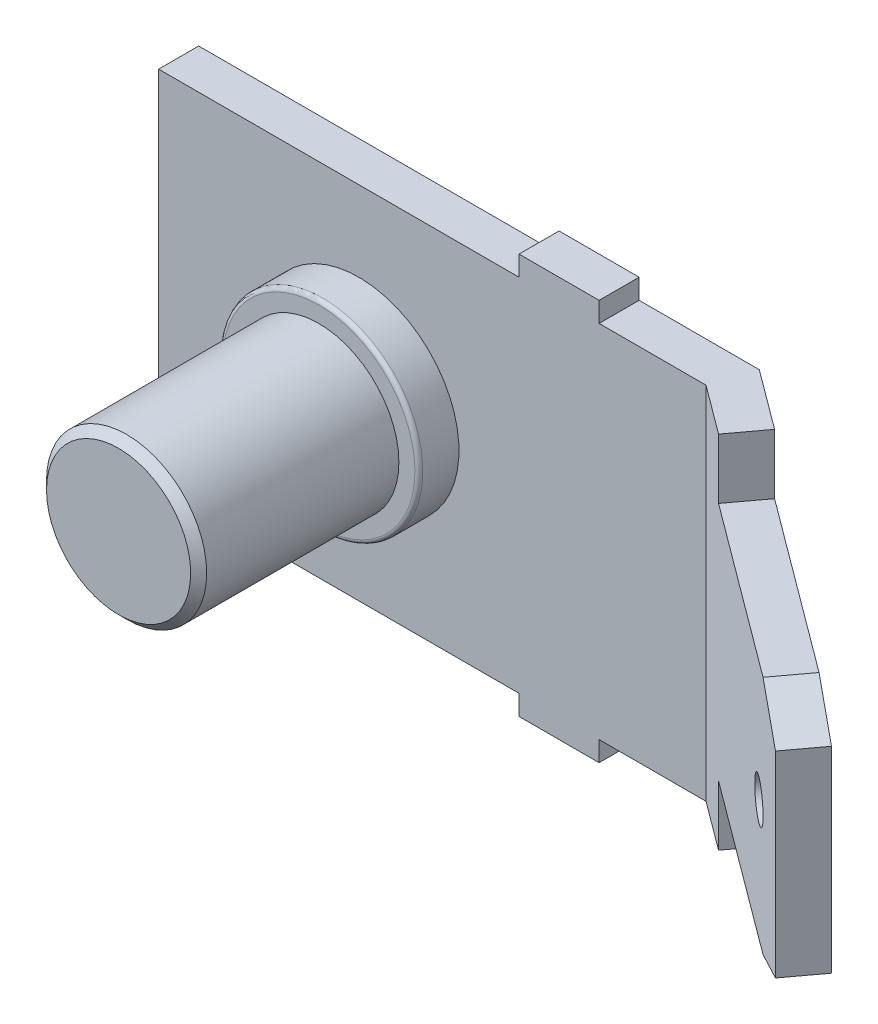
ISO-10303-21;
HEADER;
FILE_DESCRIPTION(('STEP AP214'),'2;1');
FILE_NAME('part.step','',(''),(''),'','','');
FILE_SCHEMA(('AUTOMOTIVE_DESIGN { 1 0 10303 214 1 1 1 1 }'));
ENDSEC;
DATA;
#1=APPLICATION_CONTEXT('core data for automotive mechanical design processes');
#2=APPLICATION_PROTOCOL_DEFINITION('international standard','automotive_design',2000,#1);
#3=PRODUCT_CONTEXT('',#1,'mechanical');
#4=PRODUCT('Part','Part','',(#3));
#5=PRODUCT_RELATED_PRODUCT_CATEGORY('part','',(#4));
#6=PRODUCT_DEFINITION_FORMATION('','',#4);
#7=PRODUCT_DEFINITION_CONTEXT('part definition',#1,'design');
#8=PRODUCT_DEFINITION('design','',#6,#7);
#9=PRODUCT_DEFINITION_SHAPE('','',#8);
#10=(LENGTH_UNIT() NAMED_UNIT(*) SI_UNIT(.MILLI.,.METRE.));
#11=(NAMED_UNIT(*) PLANE_ANGLE_UNIT() SI_UNIT($,.RADIAN.));
#12=(NAMED_UNIT(*) SI_UNIT($,.STERADIAN.) SOLID_ANGLE_UNIT());
#13=UNCERTAINTY_MEASURE_WITH_UNIT(LENGTH_MEASURE(1.E-05),#10,'distance_accuracy_value','');
#14=(GEOMETRIC_REPRESENTATION_CONTEXT(3) GLOBAL_UNCERTAINTY_ASSIGNED_CONTEXT((#13)) GLOBAL_UNIT_ASSIGNED_CONTEXT((#10,
#11,#12)) REPRESENTATION_CONTEXT('',''));
#15=CARTESIAN_POINT('',(0.,0.,0.));
#16=DIRECTION('',(0.,0.,1.));
#17=DIRECTION('',(1.,0.,0.));
#18=AXIS2_PLACEMENT_3D('',#15,#16,#17);
#19=CARTESIAN_POINT('',(-5.5,0.,4.00000000000001));
#20=DIRECTION('',(0.,0.,1.));
#21=DIRECTION('',(1.,0.,0.));
#22=AXIS2_PLACEMENT_3D('',#19,#20,#21);
#23=PLANE('',#22);
#24=CARTESIAN_POINT('',(-5.5,0.,4.00000000007594));
#25=DIRECTION('',(0.,0.,-1.));
#26=DIRECTION('',(-1.,0.,0.));
#27=AXIS2_PLACEMENT_3D('',#24,#25,#26);
#28=CIRCLE('',#27,1.80000000005976);
#29=CARTESIAN_POINT('',(-7.30000000005976,0.,4.00000000007594));
#30=VERTEX_POINT('',#29);
#31=EDGE_CURVE('E180',#30,#30,#28,.T.);
#32=ORIENTED_EDGE('',*,*,#31,.F.);
#33=EDGE_LOOP('',(#32));
#34=FACE_BOUND('',#33,.T.);
#35=ADVANCED_FACE('F15',(#34),#23,.T.);
#36=CARTESIAN_POINT('',(-5.5,0.,3.79999999989877));
#37=DIRECTION('',(0.,0.,-1.));
#38=DIRECTION('',(-1.,0.,0.));
#39=AXIS2_PLACEMENT_3D('',#36,#37,#38);
#40=CONICAL_SURFACE('',#39,1.99999999995271,0.785398162686906);
#41=CARTESIAN_POINT('',(-5.5,0.,3.80000000000001));
#42=DIRECTION('',(0.,0.,1.));
#43=DIRECTION('',(1.,0.,0.));
#44=AXIS2_PLACEMENT_3D('',#41,#42,#43);
#45=CIRCLE('',#44,2.);
#46=CARTESIAN_POINT('',(-3.5,0.,3.80000000000001));
#47=VERTEX_POINT('',#46);
#48=EDGE_CURVE('E445',#47,#47,#45,.F.);
#49=ORIENTED_EDGE('',*,*,#48,.F.);
#50=EDGE_LOOP('',(#49));
#51=FACE_BOUND('',#50,.T.);
#52=ORIENTED_EDGE('',*,*,#31,.T.);
#53=EDGE_LOOP('',(#52));
#54=FACE_BOUND('',#53,.T.);
#55=ADVANCED_FACE('F484',(#51,#54),#40,.T.);
#56=CARTESIAN_POINT('',(-5.5,0.,-3.99999999999999));
#57=DIRECTION('',(0.,0.,1.));
#58=DIRECTION('',(1.,0.,0.));
#59=AXIS2_PLACEMENT_3D('',#56,#57,#58);
#60=CYLINDRICAL_SURFACE('',#59,2.);
#61=ORIENTED_EDGE('',*,*,#48,.T.);
#62=EDGE_LOOP('',(#61));
#63=FACE_BOUND('',#62,.T.);
#64=CARTESIAN_POINT('',(-5.5,0.,-0.999999999999986));
#65=DIRECTION('',(0.,0.,1.));
#66=DIRECTION('',(1.,0.,0.));
#67=AXIS2_PLACEMENT_3D('',#64,#65,#66);
#68=CIRCLE('',#67,2.);
#69=CARTESIAN_POINT('',(-3.5,0.,-0.999999999999986));
#70=VERTEX_POINT('',#69);
#71=EDGE_CURVE('E177',#70,#70,#68,.F.);
#72=ORIENTED_EDGE('',*,*,#71,.F.);
#73=EDGE_LOOP('',(#72));
#74=FACE_BOUND('',#73,.T.);
#75=ADVANCED_FACE('F490',(#63,#74),#60,.T.);
#76=CARTESIAN_POINT('',(-5.5,0.,-0.999999999999986));
#77=DIRECTION('',(0.,0.,1.));
#78=DIRECTION('',(1.,0.,0.));
#79=AXIS2_PLACEMENT_3D('',#76,#77,#78);
#80=PLANE('',#79);
#81=ORIENTED_EDGE('',*,*,#71,.T.);
#82=EDGE_LOOP('',(#81));
#83=FACE_BOUND('',#82,.T.);
#84=CARTESIAN_POINT('',(-5.5,0.,-0.999999999999986));
#85=DIRECTION('',(0.,0.,-1.));
#86=DIRECTION('',(1.,0.,0.));
#87=AXIS2_PLACEMENT_3D('',#84,#85,#86);
#88=CIRCLE('',#87,2.4);
#89=CARTESIAN_POINT('',(-3.1,0.,-0.999999999999986));
#90=VERTEX_POINT('',#89);
#91=CARTESIAN_POINT('',(-5.5,-2.4,-0.999999999999986));
#92=VERTEX_POINT('',#91);
#93=EDGE_CURVE('E165',#90,#92,#88,.T.);
#94=ORIENTED_EDGE('',*,*,#93,.F.);
#95=CARTESIAN_POINT('',(-5.5,0.,-0.999999999999986));
#96=DIRECTION('',(0.,0.,-1.));
#97=DIRECTION('',(-1.,0.,0.));
#98=AXIS2_PLACEMENT_3D('',#95,#96,#97);
#99=CIRCLE('',#98,2.4);
#100=CARTESIAN_POINT('',(-7.9,0.,-0.999999999999986));
#101=VERTEX_POINT('',#100);
#102=EDGE_CURVE('E168',#101,#90,#99,.T.);
#103=ORIENTED_EDGE('',*,*,#102,.F.);
#104=CARTESIAN_POINT('',(-5.5,0.,-0.999999999999986));
#105=DIRECTION('',(0.,0.,-1.));
#106=DIRECTION('',(0.,-1.,0.));
#107=AXIS2_PLACEMENT_3D('',#104,#105,#106);
#108=CIRCLE('',#107,2.4);
#109=EDGE_CURVE('E161',#92,#101,#108,.T.);
#110=ORIENTED_EDGE('',*,*,#109,.F.);
#111=EDGE_LOOP('',(#94,#103,#110));
#112=FACE_BOUND('',#111,.T.);
#113=ADVANCED_FACE('F164',(#83,#112),#80,.T.);
#114=CARTESIAN_POINT('',(-5.5,0.,-1.09999999999999));
#115=DIRECTION('',(0.,0.,-1.));
#116=DIRECTION('',(-1.,0.,0.));
#117=AXIS2_PLACEMENT_3D('',#114,#115,#116);
#118=TOROIDAL_SURFACE('',#117,2.4,0.1);
#119=ORIENTED_EDGE('',*,*,#109,.T.);
#120=ORIENTED_EDGE('',*,*,#102,.T.);
#121=ORIENTED_EDGE('',*,*,#93,.T.);
#122=EDGE_LOOP('',(#119,#120,#121));
#123=FACE_BOUND('',#122,.T.);
#124=CARTESIAN_POINT('',(-5.5,0.,-1.09999999999999));
#125=DIRECTION('',(0.,0.,-1.));
#126=DIRECTION('',(-1.,0.,0.));
#127=AXIS2_PLACEMENT_3D('',#124,#125,#126);
#128=CIRCLE('',#127,2.5);
#129=CARTESIAN_POINT('',(-8.,0.,-1.09999999999999));
#130=VERTEX_POINT('',#129);
#131=EDGE_CURVE('E202',#130,#130,#128,.T.);
#132=ORIENTED_EDGE('',*,*,#131,.F.);
#133=EDGE_LOOP('',(#132));
#134=FACE_BOUND('',#133,.T.);
#135=ADVANCED_FACE('F174',(#123,#134),#118,.T.);
#136=CARTESIAN_POINT('',(9.90389060523475,-5.,3.));
#137=DIRECTION('',(-0.59610939476524,0.,0.80290322547155));
#138=DIRECTION('',(0.80290322547155,0.,0.59610939476524));
#139=AXIS2_PLACEMENT_3D('',#136,#137,#138);
#140=PLANE('',#139);
#141=CARTESIAN_POINT('',(8.29808415429164,0.,1.80778121046952));
#142=DIRECTION('',(0.596109394765241,0.,-0.80290322547155));
#143=DIRECTION('',(-0.80290322547155,0.,-0.596109394765241));
#144=AXIS2_PLACEMENT_3D('',#141,#142,#143);
#145=CIRCLE('',#144,0.5);
#146=CARTESIAN_POINT('',(7.89663254155587,0.,1.5097265130869));
#147=VERTEX_POINT('',#146);
#148=EDGE_CURVE('E236',#147,#147,#145,.T.);
#149=ORIENTED_EDGE('',*,*,#148,.T.);
#150=EDGE_LOOP('',(#149));
#151=FACE_BOUND('',#150,.T.);
#152=DIRECTION('',(-0.75448223618082,-0.342020143325668,-0.56015959944205));
#153=VECTOR('',#152,1.);
#154=CARTESIAN_POINT('',(9.90389060523475,-2.4540446486007,3.));
#155=LINE('',#154,#153);
#156=CARTESIAN_POINT('',(9.90389060523475,-2.4540446486007,3.));
#157=VERTEX_POINT('',#156);
#158=CARTESIAN_POINT('',(8.69953576702743,-3.,2.10583590785214));
#159=VERTEX_POINT('',#158);
#160=EDGE_CURVE('E219',#157,#159,#155,.T.);
#161=ORIENTED_EDGE('',*,*,#160,.F.);
#162=DIRECTION('',(0.,1.,0.));
#163=VECTOR('',#162,1.);
#164=CARTESIAN_POINT('',(9.90389060523476,-5.,3.));
#165=LINE('',#164,#163);
#166=CARTESIAN_POINT('',(9.90389060523475,2.4540446486007,3.));
#167=VERTEX_POINT('',#166);
#168=EDGE_CURVE('E214',#167,#157,#165,.F.);
#169=ORIENTED_EDGE('',*,*,#168,.F.);
#170=DIRECTION('',(0.75448223618082,-0.342020143325668,0.560159599442051));
#171=VECTOR('',#170,1.);
#172=CARTESIAN_POINT('',(8.69953576702743,3.,2.10583590785214));
#173=LINE('',#172,#171);
#174=CARTESIAN_POINT('',(8.69953576702743,3.,2.10583590785214));
#175=VERTEX_POINT('',#174);
#176=EDGE_CURVE('E205',#175,#167,#173,.T.);
#177=ORIENTED_EDGE('',*,*,#176,.F.);
#178=DIRECTION('',(-0.80290322547155,0.,-0.59610939476524));
#179=VECTOR('',#178,1.);
#180=CARTESIAN_POINT('',(8.69953576702743,3.,2.10583590785214));
#181=LINE('',#180,#179);
#182=CARTESIAN_POINT('',(4.3845149002657,3.,-1.09781852481504));
#183=VERTEX_POINT('',#182);
#184=EDGE_CURVE('E229',#175,#183,#181,.T.);
#185=ORIENTED_EDGE('',*,*,#184,.T.);
#186=DIRECTION('',(0.,1.,0.));
#187=VECTOR('',#186,1.);
#188=CARTESIAN_POINT('',(4.3845149002657,5.,-1.09781852481504));
#189=LINE('',#188,#187);
#190=CARTESIAN_POINT('',(4.3845149002657,4.5,-1.09781852481505));
#191=VERTEX_POINT('',#190);
#192=EDGE_CURVE('E226',#183,#191,#189,.T.);
#193=ORIENTED_EDGE('',*,*,#192,.T.);
#194=DIRECTION('',(0.80290322547155,0.,0.59610939476524));
#195=VECTOR('',#194,1.);
#196=CARTESIAN_POINT('',(9.90389060523475,4.5,3.));
#197=LINE('',#196,#195);
#198=CARTESIAN_POINT('',(3.16936140201906,4.5,-1.99999999999999));
#199=VERTEX_POINT('',#198);
#200=EDGE_CURVE('E207',#191,#199,#197,.F.);
#201=ORIENTED_EDGE('',*,*,#200,.T.);
#202=DIRECTION('',(0.,1.,0.));
#203=VECTOR('',#202,1.);
#204=CARTESIAN_POINT('',(3.16936140201906,-5.,-1.99999999999999));
#205=LINE('',#204,#203);
#206=CARTESIAN_POINT('',(3.16936140201906,-4.5,-1.99999999999999));
#207=VERTEX_POINT('',#206);
#208=EDGE_CURVE('E243',#207,#199,#205,.T.);
#209=ORIENTED_EDGE('',*,*,#208,.F.);
#210=DIRECTION('',(0.80290322547155,0.,0.59610939476524));
#211=VECTOR('',#210,1.);
#212=CARTESIAN_POINT('',(9.90389060523475,-4.5,3.));
#213=LINE('',#212,#211);
#214=CARTESIAN_POINT('',(4.3845149002657,-4.5,-1.09781852481505));
#215=VERTEX_POINT('',#214);
#216=EDGE_CURVE('E206',#207,#215,#213,.T.);
#217=ORIENTED_EDGE('',*,*,#216,.T.);
#218=DIRECTION('',(0.,1.,0.));
#219=VECTOR('',#218,1.);
#220=CARTESIAN_POINT('',(4.3845149002657,-3.,-1.09781852481505));
#221=LINE('',#220,#219);
#222=CARTESIAN_POINT('',(4.3845149002657,-3.,-1.09781852481505));
#223=VERTEX_POINT('',#222);
#224=EDGE_CURVE('E237',#215,#223,#221,.T.);
#225=ORIENTED_EDGE('',*,*,#224,.T.);
#226=DIRECTION('',(0.80290322547155,0.,0.59610939476524));
#227=VECTOR('',#226,1.);
#228=CARTESIAN_POINT('',(4.3845149002657,-3.,-1.09781852481505));
#229=LINE('',#228,#227);
#230=EDGE_CURVE('E222',#223,#159,#229,.T.);
#231=ORIENTED_EDGE('',*,*,#230,.T.);
#232=EDGE_LOOP('',(#161,#169,#177,#185,#193,#201,#209,#217,#225,#231));
#233=FACE_BOUND('',#232,.T.);
#234=ADVANCED_FACE('F193',(#151,#233),#140,.T.);
#235=CARTESIAN_POINT('',(-5.5,0.,-2.49999999999999));
#236=DIRECTION('',(0.,0.,-1.));
#237=DIRECTION('',(-1.,0.,0.));
#238=AXIS2_PLACEMENT_3D('',#235,#236,#237);
#239=CYLINDRICAL_SURFACE('',#238,2.5);
#240=ORIENTED_EDGE('',*,*,#131,.T.);
#241=EDGE_LOOP('',(#240));
#242=FACE_BOUND('',#241,.T.);
#243=CARTESIAN_POINT('',(-5.5,0.,-1.99999999999999));
#244=DIRECTION('',(0.,0.,-1.));
#245=DIRECTION('',(-1.,0.,0.));
#246=AXIS2_PLACEMENT_3D('',#243,#244,#245);
#247=CIRCLE('',#246,2.5);
#248=CARTESIAN_POINT('',(-8.,0.,-1.99999999999999));
#249=VERTEX_POINT('',#248);
#250=EDGE_CURVE('E246',#249,#249,#247,.T.);
#251=ORIENTED_EDGE('',*,*,#250,.F.);
#252=EDGE_LOOP('',(#251));
#253=FACE_BOUND('',#252,.T.);
#254=ADVANCED_FACE('F514',(#242,#253),#239,.T.);
#255=CARTESIAN_POINT('',(9.59976788351371,2.72702232430035,2.1514663411903));
#256=DIRECTION('',(0.274609076252421,0.939692620785909,0.203881420635385));
#257=DIRECTION('',(-0.959853782647116,0.280500830547832,0.));
#258=AXIS2_PLACEMENT_3D('',#255,#256,#257);
#259=PLANE('',#258);
#260=DIRECTION('',(0.754482236180821,-0.342020143325668,0.56015959944205));
#261=VECTOR('',#260,1.);
#262=CARTESIAN_POINT('',(9.29564516179267,3.,1.30293268238059));
#263=LINE('',#262,#261);
#264=CARTESIAN_POINT('',(9.29564516179267,3.,1.30293268238059));
#265=VERTEX_POINT('',#264);
#266=CARTESIAN_POINT('',(10.5,2.4540446486007,2.19709677452845));
#267=VERTEX_POINT('',#266);
#268=EDGE_CURVE('E282',#265,#267,#263,.T.);
#269=ORIENTED_EDGE('',*,*,#268,.F.);
#270=DIRECTION('',(-0.59610939476524,0.,0.80290322547155));
#271=VECTOR('',#270,1.);
#272=CARTESIAN_POINT('',(9.29564516179267,3.,1.30293268238059));
#273=LINE('',#272,#271);
#274=EDGE_CURVE('E233',#265,#175,#273,.T.);
#275=ORIENTED_EDGE('',*,*,#274,.T.);
#276=ORIENTED_EDGE('',*,*,#176,.T.);
#277=DIRECTION('',(0.59610939476524,0.,-0.80290322547155));
#278=VECTOR('',#277,1.);
#279=CARTESIAN_POINT('',(10.5,2.4540446486007,2.19709677452845));
#280=LINE('',#279,#278);
#281=EDGE_CURVE('E211',#267,#167,#280,.F.);
#282=ORIENTED_EDGE('',*,*,#281,.F.);
#283=EDGE_LOOP('',(#269,#275,#276,#282));
#284=FACE_BOUND('',#283,.T.);
#285=ADVANCED_FACE('F521',(#284),#259,.T.);
#286=CARTESIAN_POINT('',(10.5,-5.,2.19709677452845));
#287=DIRECTION('',(0.80290322547155,0.,0.59610939476524));
#288=DIRECTION('',(0.59610939476524,0.,-0.80290322547155));
#289=AXIS2_PLACEMENT_3D('',#286,#287,#288);
#290=PLANE('',#289);
#291=DIRECTION('',(-0.596109394765244,0.,0.802903225471547));
#292=VECTOR('',#291,1.);
#293=CARTESIAN_POINT('',(10.5,-2.4540446486007,2.19709677452845));
#294=LINE('',#293,#292);
#295=CARTESIAN_POINT('',(10.5,-2.4540446486007,2.19709677452845));
#296=VERTEX_POINT('',#295);
#297=EDGE_CURVE('E216',#296,#157,#294,.T.);
#298=ORIENTED_EDGE('',*,*,#297,.F.);
#299=DIRECTION('',(0.,1.,0.));
#300=VECTOR('',#299,1.);
#301=CARTESIAN_POINT('',(10.5,-5.,2.19709677452845));
#302=LINE('',#301,#300);
#303=EDGE_CURVE('E285',#267,#296,#302,.F.);
#304=ORIENTED_EDGE('',*,*,#303,.F.);
#305=ORIENTED_EDGE('',*,*,#281,.T.);
#306=ORIENTED_EDGE('',*,*,#168,.T.);
#307=EDGE_LOOP('',(#298,#304,#305,#306));
#308=FACE_BOUND('',#307,.T.);
#309=ADVANCED_FACE('F528',(#308),#290,.T.);
#310=CARTESIAN_POINT('',(9.59976788351372,-2.72702232430035,2.15146634119029));
#311=DIRECTION('',(0.274609076252421,-0.939692620785909,0.203881420635385));
#312=DIRECTION('',(0.959853782647116,0.280500830547832,0.));
#313=AXIS2_PLACEMENT_3D('',#310,#311,#312);
#314=PLANE('',#313);
#315=ORIENTED_EDGE('',*,*,#160,.T.);
#316=DIRECTION('',(0.59610939476524,0.,-0.80290322547155));
#317=VECTOR('',#316,1.);
#318=CARTESIAN_POINT('',(8.69953576702743,-3.,2.10583590785214));
#319=LINE('',#318,#317);
#320=CARTESIAN_POINT('',(9.29564516179268,-3.,1.30293268238059));
#321=VERTEX_POINT('',#320);
#322=EDGE_CURVE('E224',#159,#321,#319,.T.);
#323=ORIENTED_EDGE('',*,*,#322,.T.);
#324=DIRECTION('',(-0.75448223618082,-0.342020143325669,-0.56015959944205));
#325=VECTOR('',#324,1.);
#326=CARTESIAN_POINT('',(10.5,-2.4540446486007,2.19709677452845));
#327=LINE('',#326,#325);
#328=EDGE_CURVE('E288',#296,#321,#327,.T.);
#329=ORIENTED_EDGE('',*,*,#328,.F.);
#330=ORIENTED_EDGE('',*,*,#297,.T.);
#331=EDGE_LOOP('',(#315,#323,#329,#330));
#332=FACE_BOUND('',#331,.T.);
#333=ADVANCED_FACE('F536',(#332),#314,.T.);
#334=CARTESIAN_POINT('',(9.90389060523475,-3.,3.));
#335=DIRECTION('',(0.,1.,0.));
#336=DIRECTION('',(0.,0.,1.));
#337=AXIS2_PLACEMENT_3D('',#334,#335,#336);
#338=PLANE('',#337);
#339=ORIENTED_EDGE('',*,*,#230,.F.);
#340=DIRECTION('',(-0.59610939476524,0.,0.80290322547155));
#341=VECTOR('',#340,1.);
#342=CARTESIAN_POINT('',(4.3845149002657,-3.,-1.09781852481504));
#343=LINE('',#342,#341);
#344=CARTESIAN_POINT('',(4.98062429503095,-3.,-1.9007217502866));
#345=VERTEX_POINT('',#344);
#346=EDGE_CURVE('E239',#223,#345,#343,.F.);
#347=ORIENTED_EDGE('',*,*,#346,.T.);
#348=DIRECTION('',(-0.80290322547155,0.,-0.59610939476524));
#349=VECTOR('',#348,1.);
#350=CARTESIAN_POINT('',(3.5,-3.,-3.));
#351=LINE('',#350,#349);
#352=EDGE_CURVE('E291',#321,#345,#351,.T.);
#353=ORIENTED_EDGE('',*,*,#352,.F.);
#354=ORIENTED_EDGE('',*,*,#322,.F.);
#355=EDGE_LOOP('',(#339,#347,#353,#354));
#356=FACE_BOUND('',#355,.T.);
#357=ADVANCED_FACE('F544',(#356),#338,.F.);
#358=CARTESIAN_POINT('',(4.3845149002657,5.,-1.09781852481504));
#359=DIRECTION('',(-0.80290322547155,0.,-0.59610939476524));
#360=DIRECTION('',(-0.59610939476524,0.,0.80290322547155));
#361=AXIS2_PLACEMENT_3D('',#358,#359,#360);
#362=PLANE('',#361);
#363=ORIENTED_EDGE('',*,*,#192,.F.);
#364=DIRECTION('',(0.59610939476524,0.,-0.80290322547155));
#365=VECTOR('',#364,1.);
#366=CARTESIAN_POINT('',(4.3845149002657,3.,-1.09781852481504));
#367=LINE('',#366,#365);
#368=CARTESIAN_POINT('',(4.98062429503095,3.,-1.90072175028661));
#369=VERTEX_POINT('',#368);
#370=EDGE_CURVE('E231',#183,#369,#367,.T.);
#371=ORIENTED_EDGE('',*,*,#370,.T.);
#372=DIRECTION('',(0.,1.,0.));
#373=VECTOR('',#372,1.);
#374=CARTESIAN_POINT('',(4.98062429503095,-5.,-1.9007217502866));
#375=LINE('',#374,#373);
#376=CARTESIAN_POINT('',(4.98062429503095,4.5,-1.90072175028661));
#377=VERTEX_POINT('',#376);
#378=EDGE_CURVE('E300',#377,#369,#375,.F.);
#379=ORIENTED_EDGE('',*,*,#378,.F.);
#380=DIRECTION('',(-0.596109394765241,0.,0.802903225471549));
#381=VECTOR('',#380,1.);
#382=CARTESIAN_POINT('',(4.98062429503096,4.5,-1.90072175028661));
#383=LINE('',#382,#381);
#384=EDGE_CURVE('E276',#377,#191,#383,.T.);
#385=ORIENTED_EDGE('',*,*,#384,.T.);
#386=EDGE_LOOP('',(#363,#371,#379,#385));
#387=FACE_BOUND('',#386,.T.);
#388=ADVANCED_FACE('F552',(#387),#362,.F.);
#389=CARTESIAN_POINT('',(4.3845149002657,3.,-1.09781852481504));
#390=DIRECTION('',(0.,-1.,0.));
#391=DIRECTION('',(0.,0.,-1.));
#392=AXIS2_PLACEMENT_3D('',#389,#390,#391);
#393=PLANE('',#392);
#394=DIRECTION('',(-0.80290322547155,0.,-0.59610939476524));
#395=VECTOR('',#394,1.);
#396=CARTESIAN_POINT('',(3.5,3.,-3.));
#397=LINE('',#396,#395);
#398=EDGE_CURVE('E303',#369,#265,#397,.F.);
#399=ORIENTED_EDGE('',*,*,#398,.F.);
#400=ORIENTED_EDGE('',*,*,#370,.F.);
#401=ORIENTED_EDGE('',*,*,#184,.F.);
#402=ORIENTED_EDGE('',*,*,#274,.F.);
#403=EDGE_LOOP('',(#399,#400,#401,#402));
#404=FACE_BOUND('',#403,.T.);
#405=ADVANCED_FACE('F560',(#404),#393,.F.);
#406=CARTESIAN_POINT('',(22.9604365702263,0.,-17.941026896121));
#407=DIRECTION('',(0.596109394765241,0.,-0.80290322547155));
#408=DIRECTION('',(-0.80290322547155,0.,-0.596109394765241));
#409=AXIS2_PLACEMENT_3D('',#406,#407,#408);
#410=CYLINDRICAL_SURFACE('',#409,0.5);
#411=ORIENTED_EDGE('',*,*,#148,.F.);
#412=EDGE_LOOP('',(#411));
#413=FACE_BOUND('',#412,.T.);
#414=CARTESIAN_POINT('',(8.89419354905689,0.,1.00487798499796));
#415=DIRECTION('',(0.596109394765241,0.,-0.80290322547155));
#416=DIRECTION('',(-0.80290322547155,0.,-0.596109394765241));
#417=AXIS2_PLACEMENT_3D('',#414,#415,#416);
#418=CIRCLE('',#417,0.5);
#419=CARTESIAN_POINT('',(8.49274193632111,0.,0.706823287615339));
#420=VERTEX_POINT('',#419);
#421=EDGE_CURVE('E306',#420,#420,#418,.F.);
#422=ORIENTED_EDGE('',*,*,#421,.F.);
#423=EDGE_LOOP('',(#422));
#424=FACE_BOUND('',#423,.T.);
#425=ADVANCED_FACE('F568',(#413,#424),#410,.F.);
#426=CARTESIAN_POINT('',(4.3845149002657,-3.,-1.09781852481504));
#427=DIRECTION('',(-0.80290322547155,0.,-0.59610939476524));
#428=DIRECTION('',(-0.59610939476524,0.,0.80290322547155));
#429=AXIS2_PLACEMENT_3D('',#426,#427,#428);
#430=PLANE('',#429);
#431=DIRECTION('',(0.,1.,0.));
#432=VECTOR('',#431,1.);
#433=CARTESIAN_POINT('',(4.98062429503095,-5.,-1.9007217502866));
#434=LINE('',#433,#432);
#435=CARTESIAN_POINT('',(4.98062429503095,-4.5,-1.9007217502866));
#436=VERTEX_POINT('',#435);
#437=EDGE_CURVE('E294',#345,#436,#434,.F.);
#438=ORIENTED_EDGE('',*,*,#437,.F.);
#439=ORIENTED_EDGE('',*,*,#346,.F.);
#440=ORIENTED_EDGE('',*,*,#224,.F.);
#441=DIRECTION('',(0.596109394765241,0.,-0.802903225471549));
#442=VECTOR('',#441,1.);
#443=CARTESIAN_POINT('',(4.3845149002657,-4.5,-1.09781852481505));
#444=LINE('',#443,#442);
#445=EDGE_CURVE('E307',#215,#436,#444,.T.);
#446=ORIENTED_EDGE('',*,*,#445,.T.);
#447=EDGE_LOOP('',(#438,#439,#440,#446));
#448=FACE_BOUND('',#447,.T.);
#449=ADVANCED_FACE('F576',(#448),#430,.F.);
#450=CARTESIAN_POINT('',(3.16936140201906,-5.,-1.99999999999999));
#451=DIRECTION('',(0.,0.,1.));
#452=DIRECTION('',(1.,0.,0.));
#453=AXIS2_PLACEMENT_3D('',#450,#451,#452);
#454=PLANE('',#453);
#455=ORIENTED_EDGE('',*,*,#250,.T.);
#456=EDGE_LOOP('',(#455));
#457=FACE_BOUND('',#456,.T.);
#458=DIRECTION('',(1.,0.,0.));
#459=VECTOR('',#458,1.);
#460=CARTESIAN_POINT('',(-10.5,4.5,-1.99999999999998));
#461=LINE('',#460,#459);
#462=CARTESIAN_POINT('',(-1.5,4.5,-1.99999999999999));
#463=VERTEX_POINT('',#462);
#464=CARTESIAN_POINT('',(-10.5,4.5,-1.99999999999999));
#465=VERTEX_POINT('',#464);
#466=EDGE_CURVE('E256',#463,#465,#461,.F.);
#467=ORIENTED_EDGE('',*,*,#466,.T.);
#468=DIRECTION('',(0.,1.,0.));
#469=VECTOR('',#468,1.);
#470=CARTESIAN_POINT('',(-10.5,-5.,-1.99999999999998));
#471=LINE('',#470,#469);
#472=CARTESIAN_POINT('',(-10.5,-4.5,-1.99999999999998));
#473=VERTEX_POINT('',#472);
#474=EDGE_CURVE('E253',#473,#465,#471,.T.);
#475=ORIENTED_EDGE('',*,*,#474,.F.);
#476=DIRECTION('',(1.,0.,0.));
#477=VECTOR('',#476,1.);
#478=CARTESIAN_POINT('',(-1.5,-4.5,-1.99999999999998));
#479=LINE('',#478,#477);
#480=CARTESIAN_POINT('',(-1.5,-4.5,-1.99999999999999));
#481=VERTEX_POINT('',#480);
#482=EDGE_CURVE('E247',#473,#481,#479,.T.);
#483=ORIENTED_EDGE('',*,*,#482,.T.);
#484=DIRECTION('',(0.,1.,0.));
#485=VECTOR('',#484,1.);
#486=CARTESIAN_POINT('',(-1.5,-5.,-1.99999999999999));
#487=LINE('',#486,#485);
#488=CARTESIAN_POINT('',(-1.5,-5.,-1.99999999999999));
#489=VERTEX_POINT('',#488);
#490=EDGE_CURVE('E241',#481,#489,#487,.F.);
#491=ORIENTED_EDGE('',*,*,#490,.T.);
#492=DIRECTION('',(1.,0.,0.));
#493=VECTOR('',#492,1.);
#494=CARTESIAN_POINT('',(0.351793551152689,-5.,-1.99999999999998));
#495=LINE('',#494,#493);
#496=CARTESIAN_POINT('',(0.500000000000029,-5.,-1.99999999999999));
#497=VERTEX_POINT('',#496);
#498=EDGE_CURVE('E319',#489,#497,#495,.T.);
#499=ORIENTED_EDGE('',*,*,#498,.T.);
#500=DIRECTION('',(0.,1.,0.));
#501=VECTOR('',#500,1.);
#502=CARTESIAN_POINT('',(0.500000000000029,-4.5,-1.99999999999999));
#503=LINE('',#502,#501);
#504=CARTESIAN_POINT('',(0.500000000000029,-4.5,-1.99999999999999));
#505=VERTEX_POINT('',#504);
#506=EDGE_CURVE('E316',#497,#505,#503,.T.);
#507=ORIENTED_EDGE('',*,*,#506,.T.);
#508=DIRECTION('',(1.,0.,0.));
#509=VECTOR('',#508,1.);
#510=CARTESIAN_POINT('',(4.98062429503096,-4.5,-1.99999999999999));
#511=LINE('',#510,#509);
#512=EDGE_CURVE('E311',#505,#207,#511,.T.);
#513=ORIENTED_EDGE('',*,*,#512,.T.);
#514=ORIENTED_EDGE('',*,*,#208,.T.);
#515=DIRECTION('',(1.,0.,0.));
#516=VECTOR('',#515,1.);
#517=CARTESIAN_POINT('',(0.500000000000028,4.5,-1.99999999999999));
#518=LINE('',#517,#516);
#519=CARTESIAN_POINT('',(0.500000000000028,4.5,-1.99999999999999));
#520=VERTEX_POINT('',#519);
#521=EDGE_CURVE('E279',#199,#520,#518,.F.);
#522=ORIENTED_EDGE('',*,*,#521,.T.);
#523=DIRECTION('',(0.,1.,0.));
#524=VECTOR('',#523,1.);
#525=CARTESIAN_POINT('',(0.500000000000028,5.,-1.99999999999999));
#526=LINE('',#525,#524);
#527=CARTESIAN_POINT('',(0.500000000000028,5.,-1.99999999999999));
#528=VERTEX_POINT('',#527);
#529=EDGE_CURVE('E271',#520,#528,#526,.T.);
#530=ORIENTED_EDGE('',*,*,#529,.T.);
#531=DIRECTION('',(1.,0.,0.));
#532=VECTOR('',#531,1.);
#533=CARTESIAN_POINT('',(0.351793551152689,5.,-1.99999999999998));
#534=LINE('',#533,#532);
#535=CARTESIAN_POINT('',(-1.5,5.,-1.99999999999999));
#536=VERTEX_POINT('',#535);
#537=EDGE_CURVE('E267',#536,#528,#534,.T.);
#538=ORIENTED_EDGE('',*,*,#537,.F.);
#539=DIRECTION('',(0.,1.,0.));
#540=VECTOR('',#539,1.);
#541=CARTESIAN_POINT('',(-1.5,4.5,-1.99999999999998));
#542=LINE('',#541,#540);
#543=EDGE_CURVE('E260',#536,#463,#542,.F.);
#544=ORIENTED_EDGE('',*,*,#543,.T.);
#545=EDGE_LOOP('',(#467,#475,#483,#491,#499,#507,#513,#514,#522,#530,#538,#544));
#546=FACE_BOUND('',#545,.T.);
#547=ADVANCED_FACE('F584',(#457,#546),#454,.T.);
#548=CARTESIAN_POINT('',(-5.5,-2.5,-3.99999999999999));
#549=DIRECTION('',(0.,0.,1.));
#550=DIRECTION('',(1.,0.,0.));
#551=AXIS2_PLACEMENT_3D('',#548,#549,#550);
#552=PLANE('',#551);
#553=CARTESIAN_POINT('',(-5.5,0.,-3.99999999999999));
#554=DIRECTION('',(0.,0.,-1.));
#555=DIRECTION('',(-1.,0.,0.));
#556=AXIS2_PLACEMENT_3D('',#553,#554,#555);
#557=CIRCLE('',#556,2.5);
#558=CARTESIAN_POINT('',(-8.,0.,-3.99999999999999));
#559=VERTEX_POINT('',#558);
#560=EDGE_CURVE('E327',#559,#559,#557,.F.);
#561=ORIENTED_EDGE('',*,*,#560,.F.);
#562=EDGE_LOOP('',(#561));
#563=FACE_BOUND('',#562,.T.);
#564=ADVANCED_FACE('F592',(#563),#552,.F.);
#565=CARTESIAN_POINT('',(-1.5,-4.5,-1.99999999999998));
#566=DIRECTION('',(0.,1.,0.));
#567=DIRECTION('',(0.,0.,1.));
#568=AXIS2_PLACEMENT_3D('',#565,#566,#567);
#569=PLANE('',#568);
#570=DIRECTION('',(0.,0.,-1.));
#571=VECTOR('',#570,1.);
#572=CARTESIAN_POINT('',(-1.5,-4.5,-1.99999999999998));
#573=LINE('',#572,#571);
#574=CARTESIAN_POINT('',(-1.5,-4.5,-3.));
#575=VERTEX_POINT('',#574);
#576=EDGE_CURVE('E323',#575,#481,#573,.F.);
#577=ORIENTED_EDGE('',*,*,#576,.T.);
#578=ORIENTED_EDGE('',*,*,#482,.F.);
#579=DIRECTION('',(0.,0.,1.));
#580=VECTOR('',#579,1.);
#581=CARTESIAN_POINT('',(-10.5,-4.5,-2.));
#582=LINE('',#581,#580);
#583=CARTESIAN_POINT('',(-10.5,-4.5,-3.));
#584=VERTEX_POINT('',#583);
#585=EDGE_CURVE('E250',#584,#473,#582,.T.);
#586=ORIENTED_EDGE('',*,*,#585,.F.);
#587=DIRECTION('',(-1.,0.,0.));
#588=VECTOR('',#587,1.);
#589=CARTESIAN_POINT('',(-10.5,-4.5,-3.));
#590=LINE('',#589,#588);
#591=EDGE_CURVE('E328',#575,#584,#590,.T.);
#592=ORIENTED_EDGE('',*,*,#591,.F.);
#593=EDGE_LOOP('',(#577,#578,#586,#592));
#594=FACE_BOUND('',#593,.T.);
#595=ADVANCED_FACE('F368',(#594),#569,.F.);
#596=CARTESIAN_POINT('',(-10.5,-5.,-2.));
#597=DIRECTION('',(-1.,0.,0.));
#598=DIRECTION('',(0.,0.,1.));
#599=AXIS2_PLACEMENT_3D('',#596,#597,#598);
#600=PLANE('',#599);
#601=DIRECTION('',(0.,0.,-1.));
#602=VECTOR('',#601,1.);
#603=CARTESIAN_POINT('',(-10.5,4.5,-1.99999999999998));
#604=LINE('',#603,#602);
#605=CARTESIAN_POINT('',(-10.5,4.5,-3.));
#606=VERTEX_POINT('',#605);
#607=EDGE_CURVE('E258',#465,#606,#604,.T.);
#608=ORIENTED_EDGE('',*,*,#607,.T.);
#609=DIRECTION('',(0.,1.,0.));
#610=VECTOR('',#609,1.);
#611=CARTESIAN_POINT('',(-10.5,-5.,-3.));
#612=LINE('',#611,#610);
#613=EDGE_CURVE('E331',#584,#606,#612,.T.);
#614=ORIENTED_EDGE('',*,*,#613,.F.);
#615=ORIENTED_EDGE('',*,*,#585,.T.);
#616=ORIENTED_EDGE('',*,*,#474,.T.);
#617=EDGE_LOOP('',(#608,#614,#615,#616));
#618=FACE_BOUND('',#617,.T.);
#619=ADVANCED_FACE('F372',(#618),#600,.T.);
#620=CARTESIAN_POINT('',(-10.5,4.5,-1.99999999999998));
#621=DIRECTION('',(0.,-1.,0.));
#622=DIRECTION('',(0.,0.,-1.));
#623=AXIS2_PLACEMENT_3D('',#620,#621,#622);
#624=PLANE('',#623);
#625=ORIENTED_EDGE('',*,*,#607,.F.);
#626=ORIENTED_EDGE('',*,*,#466,.F.);
#627=DIRECTION('',(0.,0.,-1.));
#628=VECTOR('',#627,1.);
#629=CARTESIAN_POINT('',(-1.5,4.5,-1.99999999999998));
#630=LINE('',#629,#628);
#631=CARTESIAN_POINT('',(-1.5,4.5,-3.));
#632=VERTEX_POINT('',#631);
#633=EDGE_CURVE('E262',#463,#632,#630,.T.);
#634=ORIENTED_EDGE('',*,*,#633,.T.);
#635=DIRECTION('',(-1.,0.,0.));
#636=VECTOR('',#635,1.);
#637=CARTESIAN_POINT('',(-10.5,4.5,-3.));
#638=LINE('',#637,#636);
#639=EDGE_CURVE('E334',#606,#632,#638,.F.);
#640=ORIENTED_EDGE('',*,*,#639,.F.);
#641=EDGE_LOOP('',(#625,#626,#634,#640));
#642=FACE_BOUND('',#641,.T.);
#643=ADVANCED_FACE('F377',(#642),#624,.F.);
#644=CARTESIAN_POINT('',(-1.5,4.5,-1.99999999999998));
#645=DIRECTION('',(1.,0.,0.));
#646=DIRECTION('',(0.,0.,-1.));
#647=AXIS2_PLACEMENT_3D('',#644,#645,#646);
#648=PLANE('',#647);
#649=ORIENTED_EDGE('',*,*,#633,.F.);
#650=ORIENTED_EDGE('',*,*,#543,.F.);
#651=DIRECTION('',(0.,0.,1.));
#652=VECTOR('',#651,1.);
#653=CARTESIAN_POINT('',(-1.5,5.,-1.46543371676394));
#654=LINE('',#653,#652);
#655=CARTESIAN_POINT('',(-1.5,5.,-3.));
#656=VERTEX_POINT('',#655);
#657=EDGE_CURVE('E264',#656,#536,#654,.T.);
#658=ORIENTED_EDGE('',*,*,#657,.F.);
#659=DIRECTION('',(0.,1.,0.));
#660=VECTOR('',#659,1.);
#661=CARTESIAN_POINT('',(-1.5,-5.,-3.));
#662=LINE('',#661,#660);
#663=EDGE_CURVE('E337',#632,#656,#662,.T.);
#664=ORIENTED_EDGE('',*,*,#663,.F.);
#665=EDGE_LOOP('',(#649,#650,#658,#664));
#666=FACE_BOUND('',#665,.T.);
#667=ADVANCED_FACE('F381',(#666),#648,.F.);
#668=CARTESIAN_POINT('',(0.351793551152689,5.,-1.46543371676394));
#669=DIRECTION('',(0.,1.,0.));
#670=DIRECTION('',(0.,0.,1.));
#671=AXIS2_PLACEMENT_3D('',#668,#669,#670);
#672=PLANE('',#671);
#673=DIRECTION('',(0.,0.,1.));
#674=VECTOR('',#673,1.);
#675=CARTESIAN_POINT('',(0.500000000000028,5.,-1.99999999999998));
#676=LINE('',#675,#674);
#677=CARTESIAN_POINT('',(0.500000000000028,5.,-3.));
#678=VERTEX_POINT('',#677);
#679=EDGE_CURVE('E269',#528,#678,#676,.F.);
#680=ORIENTED_EDGE('',*,*,#679,.T.);
#681=DIRECTION('',(-1.,0.,0.));
#682=VECTOR('',#681,1.);
#683=CARTESIAN_POINT('',(-10.5,5.,-3.));
#684=LINE('',#683,#682);
#685=EDGE_CURVE('E340',#656,#678,#684,.F.);
#686=ORIENTED_EDGE('',*,*,#685,.F.);
#687=ORIENTED_EDGE('',*,*,#657,.T.);
#688=ORIENTED_EDGE('',*,*,#537,.T.);
#689=EDGE_LOOP('',(#680,#686,#687,#688));
#690=FACE_BOUND('',#689,.T.);
#691=ADVANCED_FACE('F385',(#690),#672,.T.);
#692=CARTESIAN_POINT('',(0.500000000000028,5.,-1.99999999999998));
#693=DIRECTION('',(-1.,0.,0.));
#694=DIRECTION('',(0.,0.,1.));
#695=AXIS2_PLACEMENT_3D('',#692,#693,#694);
#696=PLANE('',#695);
#697=DIRECTION('',(0.,0.,-1.));
#698=VECTOR('',#697,1.);
#699=CARTESIAN_POINT('',(0.500000000000028,4.5,-1.99999999999998));
#700=LINE('',#699,#698);
#701=CARTESIAN_POINT('',(0.500000000000028,4.5,-3.));
#702=VERTEX_POINT('',#701);
#703=EDGE_CURVE('E274',#520,#702,#700,.T.);
#704=ORIENTED_EDGE('',*,*,#703,.T.);
#705=DIRECTION('',(0.,1.,0.));
#706=VECTOR('',#705,1.);
#707=CARTESIAN_POINT('',(0.500000000000028,-5.,-3.));
#708=LINE('',#707,#706);
#709=EDGE_CURVE('E343',#678,#702,#708,.F.);
#710=ORIENTED_EDGE('',*,*,#709,.F.);
#711=ORIENTED_EDGE('',*,*,#679,.F.);
#712=ORIENTED_EDGE('',*,*,#529,.F.);
#713=EDGE_LOOP('',(#704,#710,#711,#712));
#714=FACE_BOUND('',#713,.T.);
#715=ADVANCED_FACE('F390',(#714),#696,.F.);
#716=CARTESIAN_POINT('',(0.500000000000028,4.5,-1.99999999999998));
#717=DIRECTION('',(0.,-1.,0.));
#718=DIRECTION('',(0.,0.,-1.));
#719=AXIS2_PLACEMENT_3D('',#716,#717,#718);
#720=PLANE('',#719);
#721=ORIENTED_EDGE('',*,*,#200,.F.);
#722=ORIENTED_EDGE('',*,*,#384,.F.);
#723=DIRECTION('',(-0.80290322547155,0.,-0.59610939476524));
#724=VECTOR('',#723,1.);
#725=CARTESIAN_POINT('',(3.5,4.5,-3.));
#726=LINE('',#725,#724);
#727=CARTESIAN_POINT('',(3.5,4.5,-3.));
#728=VERTEX_POINT('',#727);
#729=EDGE_CURVE('E297',#728,#377,#726,.F.);
#730=ORIENTED_EDGE('',*,*,#729,.F.);
#731=DIRECTION('',(-1.,0.,0.));
#732=VECTOR('',#731,1.);
#733=CARTESIAN_POINT('',(-10.5,4.5,-3.));
#734=LINE('',#733,#732);
#735=EDGE_CURVE('E346',#702,#728,#734,.F.);
#736=ORIENTED_EDGE('',*,*,#735,.F.);
#737=ORIENTED_EDGE('',*,*,#703,.F.);
#738=ORIENTED_EDGE('',*,*,#521,.F.);
#739=EDGE_LOOP('',(#721,#722,#730,#736,#737,#738));
#740=FACE_BOUND('',#739,.T.);
#741=ADVANCED_FACE('F394',(#740),#720,.F.);
#742=CARTESIAN_POINT('',(3.5,-5.,-3.));
#743=DIRECTION('',(0.59610939476524,0.,-0.80290322547155));
#744=DIRECTION('',(-0.80290322547155,0.,-0.59610939476524));
#745=AXIS2_PLACEMENT_3D('',#742,#743,#744);
#746=PLANE('',#745);
#747=ORIENTED_EDGE('',*,*,#421,.T.);
#748=EDGE_LOOP('',(#747));
#749=FACE_BOUND('',#748,.T.);
#750=ORIENTED_EDGE('',*,*,#378,.T.);
#751=ORIENTED_EDGE('',*,*,#398,.T.);
#752=ORIENTED_EDGE('',*,*,#268,.T.);
#753=ORIENTED_EDGE('',*,*,#303,.T.);
#754=ORIENTED_EDGE('',*,*,#328,.T.);
#755=ORIENTED_EDGE('',*,*,#352,.T.);
#756=ORIENTED_EDGE('',*,*,#437,.T.);
#757=DIRECTION('',(-0.802903225471555,0.,-0.596109394765234));
#758=VECTOR('',#757,1.);
#759=CARTESIAN_POINT('',(4.98062429503096,-4.5,-1.90072175028661));
#760=LINE('',#759,#758);
#761=CARTESIAN_POINT('',(3.5,-4.5,-3.));
#762=VERTEX_POINT('',#761);
#763=EDGE_CURVE('E309',#436,#762,#760,.T.);
#764=ORIENTED_EDGE('',*,*,#763,.T.);
#765=DIRECTION('',(0.,1.,0.));
#766=VECTOR('',#765,1.);
#767=CARTESIAN_POINT('',(3.5,-5.,-3.));
#768=LINE('',#767,#766);
#769=EDGE_CURVE('E349',#728,#762,#768,.F.);
#770=ORIENTED_EDGE('',*,*,#769,.F.);
#771=ORIENTED_EDGE('',*,*,#729,.T.);
#772=EDGE_LOOP('',(#750,#751,#752,#753,#754,#755,#756,#764,#770,#771));
#773=FACE_BOUND('',#772,.T.);
#774=ADVANCED_FACE('F398',(#749,#773),#746,.T.);
#775=CARTESIAN_POINT('',(4.98062429503096,-4.5,-1.99999999999999));
#776=DIRECTION('',(0.,1.,0.));
#777=DIRECTION('',(0.,0.,1.));
#778=AXIS2_PLACEMENT_3D('',#775,#776,#777);
#779=PLANE('',#778);
#780=DIRECTION('',(0.,0.,1.));
#781=VECTOR('',#780,1.);
#782=CARTESIAN_POINT('',(0.500000000000029,-4.5,-1.99999999999998));
#783=LINE('',#782,#781);
#784=CARTESIAN_POINT('',(0.500000000000029,-4.5,-3.));
#785=VERTEX_POINT('',#784);
#786=EDGE_CURVE('E314',#505,#785,#783,.F.);
#787=ORIENTED_EDGE('',*,*,#786,.T.);
#788=DIRECTION('',(-1.,0.,0.));
#789=VECTOR('',#788,1.);
#790=CARTESIAN_POINT('',(-10.5,-4.5,-3.));
#791=LINE('',#790,#789);
#792=EDGE_CURVE('E352',#762,#785,#791,.T.);
#793=ORIENTED_EDGE('',*,*,#792,.F.);
#794=ORIENTED_EDGE('',*,*,#763,.F.);
#795=ORIENTED_EDGE('',*,*,#445,.F.);
#796=ORIENTED_EDGE('',*,*,#216,.F.);
#797=ORIENTED_EDGE('',*,*,#512,.F.);
#798=EDGE_LOOP('',(#787,#793,#794,#795,#796,#797));
#799=FACE_BOUND('',#798,.T.);
#800=ADVANCED_FACE('F403',(#799),#779,.F.);
#801=CARTESIAN_POINT('',(0.500000000000029,-4.5,-1.99999999999998));
#802=DIRECTION('',(-1.,0.,0.));
#803=DIRECTION('',(0.,0.,1.));
#804=AXIS2_PLACEMENT_3D('',#801,#802,#803);
#805=PLANE('',#804);
#806=DIRECTION('',(0.,0.,1.));
#807=VECTOR('',#806,1.);
#808=CARTESIAN_POINT('',(0.500000000000029,-5.,-1.46543371676394));
#809=LINE('',#808,#807);
#810=CARTESIAN_POINT('',(0.500000000000029,-5.,-3.));
#811=VERTEX_POINT('',#810);
#812=EDGE_CURVE('E321',#497,#811,#809,.F.);
#813=ORIENTED_EDGE('',*,*,#812,.T.);
#814=DIRECTION('',(0.,1.,0.));
#815=VECTOR('',#814,1.);
#816=CARTESIAN_POINT('',(0.500000000000028,-5.,-3.));
#817=LINE('',#816,#815);
#818=EDGE_CURVE('E355',#785,#811,#817,.F.);
#819=ORIENTED_EDGE('',*,*,#818,.F.);
#820=ORIENTED_EDGE('',*,*,#786,.F.);
#821=ORIENTED_EDGE('',*,*,#506,.F.);
#822=EDGE_LOOP('',(#813,#819,#820,#821));
#823=FACE_BOUND('',#822,.T.);
#824=ADVANCED_FACE('F408',(#823),#805,.F.);
#825=CARTESIAN_POINT('',(0.351793551152689,-5.,-1.46543371676394));
#826=DIRECTION('',(0.,1.,0.));
#827=DIRECTION('',(0.,0.,1.));
#828=AXIS2_PLACEMENT_3D('',#825,#826,#827);
#829=PLANE('',#828);
#830=DIRECTION('',(-1.,0.,0.));
#831=VECTOR('',#830,1.);
#832=CARTESIAN_POINT('',(-10.5,-5.,-3.));
#833=LINE('',#832,#831);
#834=CARTESIAN_POINT('',(-1.5,-5.,-3.));
#835=VERTEX_POINT('',#834);
#836=EDGE_CURVE('E358',#811,#835,#833,.T.);
#837=ORIENTED_EDGE('',*,*,#836,.F.);
#838=ORIENTED_EDGE('',*,*,#812,.F.);
#839=ORIENTED_EDGE('',*,*,#498,.F.);
#840=DIRECTION('',(0.,0.,-1.));
#841=VECTOR('',#840,1.);
#842=CARTESIAN_POINT('',(-1.5,-5.,-1.99999999999998));
#843=LINE('',#842,#841);
#844=EDGE_CURVE('E35',#489,#835,#843,.T.);
#845=ORIENTED_EDGE('',*,*,#844,.T.);
#846=EDGE_LOOP('',(#837,#838,#839,#845));
#847=FACE_BOUND('',#846,.T.);
#848=ADVANCED_FACE('F410',(#847),#829,.F.);
#849=CARTESIAN_POINT('',(-1.5,-5.,-1.99999999999998));
#850=DIRECTION('',(1.,0.,0.));
#851=DIRECTION('',(0.,0.,-1.));
#852=AXIS2_PLACEMENT_3D('',#849,#850,#851);
#853=PLANE('',#852);
#854=ORIENTED_EDGE('',*,*,#844,.F.);
#855=ORIENTED_EDGE('',*,*,#490,.F.);
#856=ORIENTED_EDGE('',*,*,#576,.F.);
#857=DIRECTION('',(0.,1.,0.));
#858=VECTOR('',#857,1.);
#859=CARTESIAN_POINT('',(-1.5,-5.,-3.));
#860=LINE('',#859,#858);
#861=EDGE_CURVE('E26',#835,#575,#860,.T.);
#862=ORIENTED_EDGE('',*,*,#861,.F.);
#863=EDGE_LOOP('',(#854,#855,#856,#862));
#864=FACE_BOUND('',#863,.T.);
#865=ADVANCED_FACE('F366',(#864),#853,.F.);
#866=CARTESIAN_POINT('',(-5.5,0.,-2.49999999999999));
#867=DIRECTION('',(0.,0.,-1.));
#868=DIRECTION('',(-1.,0.,0.));
#869=AXIS2_PLACEMENT_3D('',#866,#867,#868);
#870=CYLINDRICAL_SURFACE('',#869,2.5);
#871=ORIENTED_EDGE('',*,*,#560,.T.);
#872=EDGE_LOOP('',(#871));
#873=FACE_BOUND('',#872,.T.);
#874=CARTESIAN_POINT('',(-5.5,0.,-3.));
#875=DIRECTION('',(0.,0.,-1.));
#876=DIRECTION('',(-1.,0.,0.));
#877=AXIS2_PLACEMENT_3D('',#874,#875,#876);
#878=CIRCLE('',#877,2.5);
#879=CARTESIAN_POINT('',(-8.,0.,-3.));
#880=VERTEX_POINT('',#879);
#881=EDGE_CURVE('E10',#880,#880,#878,.F.);
#882=ORIENTED_EDGE('',*,*,#881,.F.);
#883=EDGE_LOOP('',(#882));
#884=FACE_BOUND('',#883,.T.);
#885=ADVANCED_FACE('F418',(#873,#884),#870,.T.);
#886=CARTESIAN_POINT('',(-10.5,-5.,-3.));
#887=DIRECTION('',(0.,0.,-1.));
#888=DIRECTION('',(-1.,0.,0.));
#889=AXIS2_PLACEMENT_3D('',#886,#887,#888);
#890=PLANE('',#889);
#891=ORIENTED_EDGE('',*,*,#881,.T.);
#892=EDGE_LOOP('',(#891));
#893=FACE_BOUND('',#892,.T.);
#894=ORIENTED_EDGE('',*,*,#836,.T.);
#895=ORIENTED_EDGE('',*,*,#861,.T.);
#896=ORIENTED_EDGE('',*,*,#591,.T.);
#897=ORIENTED_EDGE('',*,*,#613,.T.);
#898=ORIENTED_EDGE('',*,*,#639,.T.);
#899=ORIENTED_EDGE('',*,*,#663,.T.);
#900=ORIENTED_EDGE('',*,*,#685,.T.);
#901=ORIENTED_EDGE('',*,*,#709,.T.);
#902=ORIENTED_EDGE('',*,*,#735,.T.);
#903=ORIENTED_EDGE('',*,*,#769,.T.);
#904=ORIENTED_EDGE('',*,*,#792,.T.);
#905=ORIENTED_EDGE('',*,*,#818,.T.);
#906=EDGE_LOOP('',(#894,#895,#896,#897,#898,#899,#900,#901,#902,#903,#904,#905));
#907=FACE_BOUND('',#906,.T.);
#908=ADVANCED_FACE('F363',(#893,#907),#890,.T.);
#909=CLOSED_SHELL('',(#35,#55,#75,#113,#135,#234,#254,#285,#309,#333,#357,#388,#405,#425,#449,
#547,#564,#595,#619,#643,#667,#691,#715,#741,#774,#800,#824,#848,#865,#885,#908));
#910=MANIFOLD_SOLID_BREP('B1',#909);
#911=ADVANCED_BREP_SHAPE_REPRESENTATION('',(#18,#910),#14);
#912=SHAPE_DEFINITION_REPRESENTATION(#9,#911);
ENDSEC;
END-ISO-10303-21;
